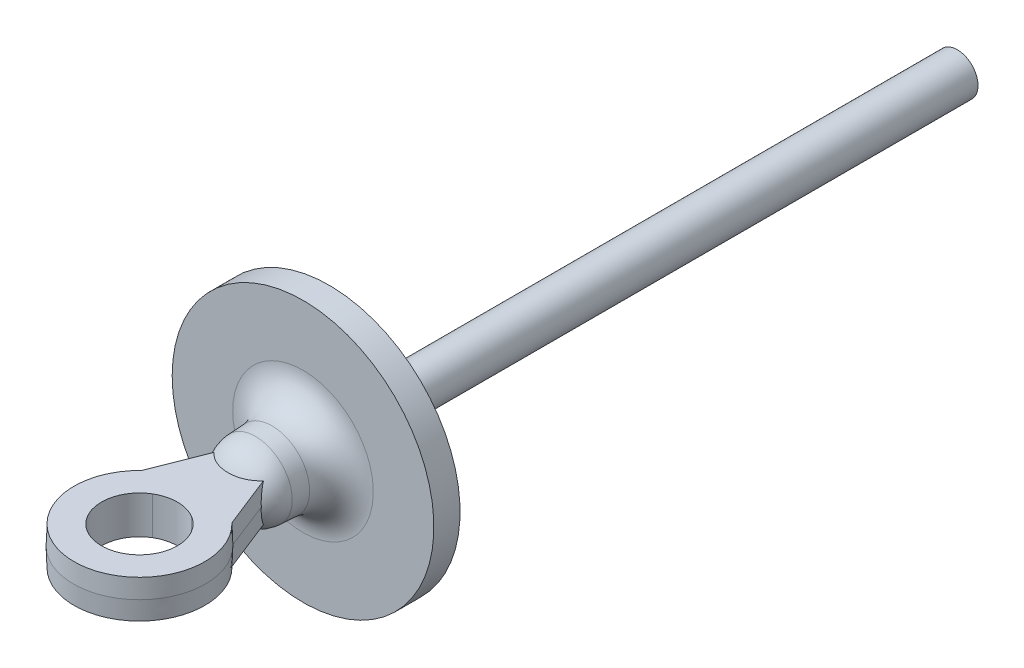
ISO-10303-21;
HEADER;
FILE_DESCRIPTION(('STEP AP214'),'2;1');
FILE_NAME('part.step','',(''),(''),'','','');
FILE_SCHEMA(('AUTOMOTIVE_DESIGN { 1 0 10303 214 1 1 1 1 }'));
ENDSEC;
DATA;
#1=APPLICATION_CONTEXT('core data for automotive mechanical design processes');
#2=APPLICATION_PROTOCOL_DEFINITION('international standard','automotive_design',2000,#1);
#3=PRODUCT_CONTEXT('',#1,'mechanical');
#4=PRODUCT('Part','Part','',(#3));
#5=PRODUCT_RELATED_PRODUCT_CATEGORY('part','',(#4));
#6=PRODUCT_DEFINITION_FORMATION('','',#4);
#7=PRODUCT_DEFINITION_CONTEXT('part definition',#1,'design');
#8=PRODUCT_DEFINITION('design','',#6,#7);
#9=PRODUCT_DEFINITION_SHAPE('','',#8);
#10=(LENGTH_UNIT() NAMED_UNIT(*) SI_UNIT(.MILLI.,.METRE.));
#11=(NAMED_UNIT(*) PLANE_ANGLE_UNIT() SI_UNIT($,.RADIAN.));
#12=(NAMED_UNIT(*) SI_UNIT($,.STERADIAN.) SOLID_ANGLE_UNIT());
#13=UNCERTAINTY_MEASURE_WITH_UNIT(LENGTH_MEASURE(1.E-05),#10,'distance_accuracy_value','');
#14=(GEOMETRIC_REPRESENTATION_CONTEXT(3) GLOBAL_UNCERTAINTY_ASSIGNED_CONTEXT((#13)) GLOBAL_UNIT_ASSIGNED_CONTEXT((#10,
#11,#12)) REPRESENTATION_CONTEXT('',''));
#15=CARTESIAN_POINT('',(0.,0.,0.));
#16=DIRECTION('',(0.,0.,1.));
#17=DIRECTION('',(1.,0.,0.));
#18=AXIS2_PLACEMENT_3D('',#15,#16,#17);
#19=CARTESIAN_POINT('',(0.,3.,12.5));
#20=DIRECTION('',(0.,-1.,0.));
#21=DIRECTION('',(0.,0.,-1.));
#22=AXIS2_PLACEMENT_3D('',#19,#20,#21);
#23=CYLINDRICAL_SURFACE('',#22,2.9);
#24=DIRECTION('',(0.,-1.,0.));
#25=VECTOR('',#24,1.);
#26=CARTESIAN_POINT('',(-1.5,3.,14.9819347291982));
#27=LINE('',#26,#25);
#28=CARTESIAN_POINT('',(-1.5,-1.45,14.9819347291982));
#29=VERTEX_POINT('',#28);
#30=CARTESIAN_POINT('',(-1.5,1.45,14.9819347291982));
#31=VERTEX_POINT('',#30);
#32=EDGE_CURVE('E66',#29,#31,#27,.F.);
#33=ORIENTED_EDGE('',*,*,#32,.F.);
#34=CARTESIAN_POINT('',(0.,-1.45,12.5));
#35=DIRECTION('',(0.,-1.,0.));
#36=DIRECTION('',(0.,0.,-1.));
#37=AXIS2_PLACEMENT_3D('',#34,#35,#36);
#38=CIRCLE('',#37,2.9);
#39=CARTESIAN_POINT('',(-1.5,-1.45,10.0180652708018));
#40=VERTEX_POINT('',#39);
#41=EDGE_CURVE('E345',#29,#40,#38,.T.);
#42=ORIENTED_EDGE('',*,*,#41,.T.);
#43=DIRECTION('',(0.,-1.,0.));
#44=VECTOR('',#43,1.);
#45=CARTESIAN_POINT('',(-1.5,3.,10.0180652708018));
#46=LINE('',#45,#44);
#47=CARTESIAN_POINT('',(-1.5,1.45,10.0180652708018));
#48=VERTEX_POINT('',#47);
#49=EDGE_CURVE('E58',#48,#40,#46,.T.);
#50=ORIENTED_EDGE('',*,*,#49,.F.);
#51=CARTESIAN_POINT('',(0.,1.45,12.5));
#52=DIRECTION('',(0.,1.,0.));
#53=DIRECTION('',(0.,0.,1.));
#54=AXIS2_PLACEMENT_3D('',#51,#52,#53);
#55=CIRCLE('',#54,2.9);
#56=EDGE_CURVE('E352',#48,#31,#55,.T.);
#57=ORIENTED_EDGE('',*,*,#56,.T.);
#58=EDGE_LOOP('',(#33,#42,#50,#57));
#59=FACE_BOUND('',#58,.T.);
#60=ADVANCED_FACE('F43',(#59),#23,.F.);
#61=CARTESIAN_POINT('',(1.5,-1.45,14.9819347291982));
#62=VERTEX_POINT('',#61);
#63=EDGE_CURVE('E349',#62,#29,#38,.T.);
#64=ORIENTED_EDGE('',*,*,#63,.T.);
#65=ORIENTED_EDGE('',*,*,#32,.T.);
#66=CARTESIAN_POINT('',(1.5,1.45,14.9819347291982));
#67=VERTEX_POINT('',#66);
#68=EDGE_CURVE('E350',#31,#67,#55,.T.);
#69=ORIENTED_EDGE('',*,*,#68,.T.);
#70=DIRECTION('',(0.,-1.,0.));
#71=VECTOR('',#70,1.);
#72=CARTESIAN_POINT('',(1.5,3.,14.9819347291982));
#73=LINE('',#72,#71);
#74=EDGE_CURVE('E289',#67,#62,#73,.T.);
#75=ORIENTED_EDGE('',*,*,#74,.T.);
#76=EDGE_LOOP('',(#64,#65,#69,#75));
#77=FACE_BOUND('',#76,.T.);
#78=ADVANCED_FACE('F313',(#77),#23,.F.);
#79=DIRECTION('',(0.,-1.,0.));
#80=VECTOR('',#79,1.);
#81=CARTESIAN_POINT('',(1.5,3.,10.0180652708018));
#82=LINE('',#81,#80);
#83=CARTESIAN_POINT('',(1.5,-1.45,10.0180652708018));
#84=VERTEX_POINT('',#83);
#85=CARTESIAN_POINT('',(1.5,1.45,10.0180652708018));
#86=VERTEX_POINT('',#85);
#87=EDGE_CURVE('E292',#84,#86,#82,.F.);
#88=ORIENTED_EDGE('',*,*,#87,.F.);
#89=EDGE_CURVE('E341',#84,#62,#38,.T.);
#90=ORIENTED_EDGE('',*,*,#89,.T.);
#91=ORIENTED_EDGE('',*,*,#74,.F.);
#92=EDGE_CURVE('E253',#67,#86,#55,.T.);
#93=ORIENTED_EDGE('',*,*,#92,.T.);
#94=EDGE_LOOP('',(#88,#90,#91,#93));
#95=FACE_BOUND('',#94,.T.);
#96=ADVANCED_FACE('F319',(#95),#23,.F.);
#97=CARTESIAN_POINT('',(0.,0.,0.));
#98=DIRECTION('',(0.,0.,-1.));
#99=DIRECTION('',(1.,0.,0.));
#100=AXIS2_PLACEMENT_3D('',#97,#98,#99);
#101=CONICAL_SURFACE('',#100,3.,0.0523598775598299);
#102=CARTESIAN_POINT('',(0.,0.,2.36916010939264));
#103=DIRECTION('',(0.,0.,-1.));
#104=DIRECTION('',(-1.,0.,0.));
#105=AXIS2_PLACEMENT_3D('',#102,#103,#104);
#106=CIRCLE('',#105,2.87583757990077);
#107=CARTESIAN_POINT('',(-2.87583757990077,0.,2.36916010939264));
#108=VERTEX_POINT('',#107);
#109=EDGE_CURVE('E284',#108,#108,#106,.F.);
#110=ORIENTED_EDGE('',*,*,#109,.T.);
#111=EDGE_LOOP('',(#110));
#112=FACE_BOUND('',#111,.T.);
#113=CARTESIAN_POINT('',(0.,0.,3.63083989060736));
#114=DIRECTION('',(0.,0.,-1.));
#115=DIRECTION('',(-1.,0.,0.));
#116=AXIS2_PLACEMENT_3D('',#113,#114,#115);
#117=CIRCLE('',#116,2.80971574440099);
#118=CARTESIAN_POINT('',(-2.80971574440099,0.,3.63083989060736));
#119=VERTEX_POINT('',#118);
#120=EDGE_CURVE('E155',#119,#119,#117,.T.);
#121=ORIENTED_EDGE('',*,*,#120,.T.);
#122=EDGE_LOOP('',(#121));
#123=FACE_BOUND('',#122,.T.);
#124=ADVANCED_FACE('F212',(#112,#123),#101,.T.);
#125=CARTESIAN_POINT('',(0.,0.,3.5));
#126=DIRECTION('',(0.,0.,1.));
#127=DIRECTION('',(1.,0.,0.));
#128=AXIS2_PLACEMENT_3D('',#125,#126,#127);
#129=DEGENERATE_TOROIDAL_SURFACE('',#128,0.313141907514554,2.5,.T.);
#130=CARTESIAN_POINT('',(0.,1.45,5.72655646179259));
#131=CARTESIAN_POINT('',(-0.129432593562339,1.45,5.72655944428097));
#132=CARTESIAN_POINT('',(-0.25891069393167,1.45,5.71774550370357));
#133=CARTESIAN_POINT('',(-0.515472929276135,1.45,5.68200671977936));
#134=CARTESIAN_POINT('',(-0.642554763818849,1.45,5.6550653016633));
#135=CARTESIAN_POINT('',(-0.914960953573059,1.45,5.575254194133));
#136=CARTESIAN_POINT('',(-1.05916477908325,1.45,5.51843126446166));
#137=CARTESIAN_POINT('',(-1.33380919502062,1.45,5.37783438260432));
#138=CARTESIAN_POINT('',(-1.46425847907008,1.45,5.29407759133726));
#139=CARTESIAN_POINT('',(-1.69008827611561,1.45,5.11404249081609));
#140=CARTESIAN_POINT('',(-1.7878183681388,1.45,5.02070292204882));
#141=CARTESIAN_POINT('',(-1.96465283927292,1.45,4.81778176007111));
#142=CARTESIAN_POINT('',(-2.04376458793473,1.45,4.70820662133922));
#143=CARTESIAN_POINT('',(-2.17525604669129,1.45,4.48504570467868));
#144=CARTESIAN_POINT('',(-2.22919399080737,1.45,4.37237479701423));
#145=CARTESIAN_POINT('',(-2.31683466177211,1.45,4.13942935715929));
#146=CARTESIAN_POINT('',(-2.35054253415065,1.45,4.01915676707076));
#147=CARTESIAN_POINT('',(-2.39604842669348,1.45,3.77765905330952));
#148=CARTESIAN_POINT('',(-2.40837269438678,1.45,3.65653276482782));
#149=CARTESIAN_POINT('',(-2.41236179725301,1.45,3.41394011254067));
#150=CARTESIAN_POINT('',(-2.40402742650024,1.45,3.29247376198574));
#151=CARTESIAN_POINT('',(-2.36708519784108,1.45,3.05350372859745));
#152=CARTESIAN_POINT('',(-2.33861341180446,1.45,2.93597896394068));
#153=CARTESIAN_POINT('',(-2.26242637086176,1.45,2.70735096778084));
#154=CARTESIAN_POINT('',(-2.21471157309239,1.45,2.59624758380324));
#155=CARTESIAN_POINT('',(-2.10125159303751,1.45,2.38303819516633));
#156=CARTESIAN_POINT('',(-2.03542724922457,1.45,2.28097435591363));
#157=CARTESIAN_POINT('',(-1.88786524087532,1.45,2.0890994421096));
#158=CARTESIAN_POINT('',(-1.80612657564311,1.45,1.99928913866749));
#159=CARTESIAN_POINT('',(-1.62754147830039,1.45,1.83254118270238));
#160=CARTESIAN_POINT('',(-1.53044019371077,1.45,1.75587689544591));
#161=CARTESIAN_POINT('',(-1.32526220301271,1.45,1.61911226008083));
#162=CARTESIAN_POINT('',(-1.21718622971569,1.45,1.55901080701827));
#163=CARTESIAN_POINT('',(-0.987697317999504,1.45,1.45358349369978));
#164=CARTESIAN_POINT('',(-0.865891632246593,1.45,1.40911653650356));
#165=CARTESIAN_POINT('',(-0.616955438332788,1.45,1.33897833934028));
#166=CARTESIAN_POINT('',(-0.489820291704596,1.45,1.3133238474775));
#167=CARTESIAN_POINT('',(-0.218708461265621,1.45,1.27813559717604));
#168=CARTESIAN_POINT('',(-0.0744555168632201,1.45,1.27075739550981));
#169=CARTESIAN_POINT('',(0.213672924824405,1.45,1.27783648934484));
#170=CARTESIAN_POINT('',(0.357548141404934,1.45,1.29230698017118));
#171=CARTESIAN_POINT('',(0.577061114087893,1.45,1.33228599961138));
#172=CARTESIAN_POINT('',(0.654200760048113,1.45,1.3498696003863));
#173=CARTESIAN_POINT('',(0.806526236429909,1.45,1.392047485229));
#174=CARTESIAN_POINT('',(0.881712948978836,1.45,1.4166385418002));
#175=CARTESIAN_POINT('',(1.02933956399933,1.45,1.47290101197061));
#176=CARTESIAN_POINT('',(1.1017814178851,1.45,1.50456728074244));
#177=CARTESIAN_POINT('',(1.24314257796768,1.45,1.57491403419551));
#178=CARTESIAN_POINT('',(1.3120624319109,1.45,1.61359342390466));
#179=CARTESIAN_POINT('',(1.49725981156641,1.45,1.73040965937281));
#180=CARTESIAN_POINT('',(1.60900226991726,1.45,1.81594847893451));
#181=CARTESIAN_POINT('',(1.81446692252279,1.45,2.00639898759868));
#182=CARTESIAN_POINT('',(1.90819434208063,1.45,2.11130504183003));
#183=CARTESIAN_POINT('',(2.06577984593887,1.45,2.32595925209762));
#184=CARTESIAN_POINT('',(2.13166663033934,1.45,2.43422168303378));
#185=CARTESIAN_POINT('',(2.24356822545718,1.45,2.66054944264468));
#186=CARTESIAN_POINT('',(2.28959045344593,1.45,2.77861109269995));
#187=CARTESIAN_POINT('',(2.35901933504922,1.45,3.0167947822558));
#188=CARTESIAN_POINT('',(2.38314834727159,1.45,3.13670683981947));
#189=CARTESIAN_POINT('',(2.41069777738649,1.45,3.37888803262521));
#190=CARTESIAN_POINT('',(2.41411942777485,1.45,3.50115702714853));
#191=CARTESIAN_POINT('',(2.40022084573934,1.45,3.7432093570347));
#192=CARTESIAN_POINT('',(2.38311892105719,1.45,3.86300530788176));
#193=CARTESIAN_POINT('',(2.32906868447815,1.45,4.09802735392697));
#194=CARTESIAN_POINT('',(2.29212083221616,1.45,4.21325355489489));
#195=CARTESIAN_POINT('',(2.19945561520322,1.45,4.4360700537067));
#196=CARTESIAN_POINT('',(2.14371279319005,1.45,4.54364975399851));
#197=CARTESIAN_POINT('',(2.01518795537887,1.45,4.74807954381759));
#198=CARTESIAN_POINT('',(1.94240594873373,1.45,4.84492963910838));
#199=CARTESIAN_POINT('',(1.78090759706314,1.45,5.02667593577594));
#200=CARTESIAN_POINT('',(1.69198580940245,1.45,5.11138934935079));
#201=CARTESIAN_POINT('',(1.50161893313016,1.45,5.2652981610603));
#202=CARTESIAN_POINT('',(1.40017209502277,1.45,5.33449138752861));
#203=CARTESIAN_POINT('',(1.18374649751807,1.45,5.45843831258769));
#204=CARTESIAN_POINT('',(1.06840247660055,1.45,5.51255165226957));
#205=CARTESIAN_POINT('',(0.830838884987243,1.45,5.60239258068455));
#206=CARTESIAN_POINT('',(0.708620391589674,1.45,5.63812304134198));
#207=CARTESIAN_POINT('',(0.48858165889762,1.45,5.68564446463316));
#208=CARTESIAN_POINT('',(0.391509554092255,1.45,5.70102573476573));
#209=CARTESIAN_POINT('',(0.196300349225021,1.45,5.72148053972361));
#210=CARTESIAN_POINT('',(0.0981632621224855,1.45,5.72655419983693));
#211=CARTESIAN_POINT('',(0.,1.45,5.72655646179259));
#212=B_SPLINE_CURVE_WITH_KNOTS('',3,(#130,#131,#132,#133,#134,#135,#136,#137,#138,#139,#140,
#141,#142,#143,#144,#145,#146,#147,#148,#149,#150,#151,#152,#153,#154,#155,#156,#157,#158,#159,
#160,#161,#162,#163,#164,#165,#166,#167,#168,#169,#170,#171,#172,#173,#174,#175,#176,#177,#178,
#179,#180,#181,#182,#183,#184,#185,#186,#187,#188,#189,#190,#191,#192,#193,#194,#195,#196,#197,
#198,#199,#200,#201,#202,#203,#204,#205,#206,#207,#208,#209,#210,#211),.UNSPECIFIED.,.T.,.F.,(4,
2,2,2,2,2,2,2,2,2,2,2,2,2,2,2,2,2,2,2,2,2,2,2,2,2,2,2,2,2,2,2,2,2,2,2,2,2,2,2,4),(0.,
0.38805083592315,0.776456967237292,1.23864674616536,1.70054262226772,2.10381060569464,
2.50691869727785,2.87983881335085,3.25266403674374,3.61617658104903,3.97967515291897,
4.34074068491568,4.70179763994994,5.06445865683153,5.42714248528368,5.79663621738755,
6.16610529353943,6.55350999143322,6.94125916534668,7.37293596803576,7.8048735824228,
8.04194529196958,8.27890798693873,8.5156989291473,8.75245293251589,9.17206141552596,
9.59154800586081,9.96986415673185,10.3480389248264,10.7132269607965,11.0783932606727,
11.4397094991071,11.8010173697597,12.1628166010016,12.5246156378977,12.8913921598034,
13.2582199710413,13.6388332251108,14.0193869985821,14.3136930763034,14.6079955767415),.UNSPECIFIED.);
#213=CARTESIAN_POINT('',(1.88397693499919,1.45,4.9103116327655));
#214=VERTEX_POINT('',#213);
#215=CARTESIAN_POINT('',(-1.88397693500169,1.45,4.91031163277184));
#216=VERTEX_POINT('',#215);
#217=EDGE_CURVE('E198',#214,#216,#212,.T.);
#218=ORIENTED_EDGE('',*,*,#217,.F.);
#219=CARTESIAN_POINT('',(1.88392343403672,1.4502,4.91019512697445));
#220=CARTESIAN_POINT('',(1.89857066782441,1.39545097410603,4.94209208780257));
#221=CARTESIAN_POINT('',(1.91246457356835,1.33934930373896,4.97195210861302));
#222=CARTESIAN_POINT('',(1.93869681601967,1.22478940428401,5.02750753128141));
#223=CARTESIAN_POINT('',(1.95103558062409,1.16633182929131,5.05320407927686));
#224=CARTESIAN_POINT('',(1.9851602314905,0.990463485823493,5.12292159861242));
#225=CARTESIAN_POINT('',(2.00468763179078,0.870168848498023,5.16094720220688));
#226=CARTESIAN_POINT('',(2.03702175188753,0.627175606075397,5.21974523590089));
#227=CARTESIAN_POINT('',(2.0499521758606,0.504569711140613,5.24083984530746));
#228=CARTESIAN_POINT('',(2.06975745738624,0.254561968634857,5.26723324476132));
#229=CARTESIAN_POINT('',(2.07649965569111,0.127113464133685,5.27219155069367));
#230=CARTESIAN_POINT('',(2.07992207646305,-0.000199999999999989,5.26875317685439));
#231=B_SPLINE_CURVE_WITH_KNOTS('',3,(#219,#220,#221,#222,#223,#224,#225,#226,#227,#228,#229,
#230),.UNSPECIFIED.,.F.,.F.,(4,2,2,2,2,4),(0.,0.194995372853274,0.389936975058389,
0.771423053302842,1.14546527465368,1.52735048015725),.UNSPECIFIED.);
#232=CARTESIAN_POINT('',(2.07991669401542,0.,5.26875856288613));
#233=VERTEX_POINT('',#232);
#234=EDGE_CURVE('E190',#214,#233,#231,.T.);
#235=ORIENTED_EDGE('',*,*,#234,.T.);
#236=CARTESIAN_POINT('',(1.88392343403672,-1.4502,4.91019512697445));
#237=CARTESIAN_POINT('',(1.89857066782441,-1.39545097410603,4.94209208780257));
#238=CARTESIAN_POINT('',(1.91246457356835,-1.33934930373896,4.97195210861302));
#239=CARTESIAN_POINT('',(1.93869681601967,-1.22478940428401,5.02750753128141));
#240=CARTESIAN_POINT('',(1.95103558062409,-1.16633182929131,5.05320407927686));
#241=CARTESIAN_POINT('',(1.9851602314905,-0.990463485823493,5.12292159861242));
#242=CARTESIAN_POINT('',(2.00468763179078,-0.870168848498023,5.16094720220688));
#243=CARTESIAN_POINT('',(2.03702175188753,-0.627175606075397,5.21974523590089));
#244=CARTESIAN_POINT('',(2.0499521758606,-0.504569711140613,5.24083984530746));
#245=CARTESIAN_POINT('',(2.06975745738624,-0.254561968634857,5.26723324476132));
#246=CARTESIAN_POINT('',(2.07649965569111,-0.127113464133685,5.27219155069367));
#247=CARTESIAN_POINT('',(2.07992207646305,0.000199999999999989,5.26875317685439));
#248=B_SPLINE_CURVE_WITH_KNOTS('',3,(#236,#237,#238,#239,#240,#241,#242,#243,#244,#245,#246,
#247),.UNSPECIFIED.,.F.,.F.,(4,2,2,2,2,4),(0.,0.194995372853274,0.389936975058389,
0.771423053302842,1.14546527465368,1.52735048015725),.UNSPECIFIED.);
#249=CARTESIAN_POINT('',(1.88397693499919,-1.45,4.9103116327655));
#250=VERTEX_POINT('',#249);
#251=EDGE_CURVE('E142',#250,#233,#248,.T.);
#252=ORIENTED_EDGE('',*,*,#251,.F.);
#253=CARTESIAN_POINT('',(0.,-1.45,5.72655646179259));
#254=CARTESIAN_POINT('',(-0.129432593562339,-1.45,5.72655944428097));
#255=CARTESIAN_POINT('',(-0.25891069393167,-1.45,5.71774550370357));
#256=CARTESIAN_POINT('',(-0.515472929276135,-1.45,5.68200671977936));
#257=CARTESIAN_POINT('',(-0.642554763818849,-1.45,5.6550653016633));
#258=CARTESIAN_POINT('',(-0.914960953573059,-1.45,5.575254194133));
#259=CARTESIAN_POINT('',(-1.05916477908325,-1.45,5.51843126446166));
#260=CARTESIAN_POINT('',(-1.33380919502062,-1.45,5.37783438260432));
#261=CARTESIAN_POINT('',(-1.46425847907008,-1.45,5.29407759133726));
#262=CARTESIAN_POINT('',(-1.69008827611561,-1.45,5.11404249081609));
#263=CARTESIAN_POINT('',(-1.7878183681388,-1.45,5.02070292204882));
#264=CARTESIAN_POINT('',(-1.96465283927292,-1.45,4.81778176007111));
#265=CARTESIAN_POINT('',(-2.04376458793473,-1.45,4.70820662133922));
#266=CARTESIAN_POINT('',(-2.17525604669129,-1.45,4.48504570467868));
#267=CARTESIAN_POINT('',(-2.22919399080737,-1.45,4.37237479701423));
#268=CARTESIAN_POINT('',(-2.31683466177211,-1.45,4.13942935715929));
#269=CARTESIAN_POINT('',(-2.35054253415065,-1.45,4.01915676707076));
#270=CARTESIAN_POINT('',(-2.39604842669348,-1.45,3.77765905330952));
#271=CARTESIAN_POINT('',(-2.40837269438678,-1.45,3.65653276482782));
#272=CARTESIAN_POINT('',(-2.41236179725301,-1.45,3.41394011254067));
#273=CARTESIAN_POINT('',(-2.40402742650024,-1.45,3.29247376198574));
#274=CARTESIAN_POINT('',(-2.36708519784108,-1.45,3.05350372859745));
#275=CARTESIAN_POINT('',(-2.33861341180446,-1.45,2.93597896394068));
#276=CARTESIAN_POINT('',(-2.26242637086176,-1.45,2.70735096778084));
#277=CARTESIAN_POINT('',(-2.21471157309239,-1.45,2.59624758380324));
#278=CARTESIAN_POINT('',(-2.10125159303751,-1.45,2.38303819516633));
#279=CARTESIAN_POINT('',(-2.03542724922457,-1.45,2.28097435591363));
#280=CARTESIAN_POINT('',(-1.88786524087532,-1.45,2.0890994421096));
#281=CARTESIAN_POINT('',(-1.80612657564311,-1.45,1.99928913866749));
#282=CARTESIAN_POINT('',(-1.62754147830039,-1.45,1.83254118270238));
#283=CARTESIAN_POINT('',(-1.53044019371077,-1.45,1.75587689544591));
#284=CARTESIAN_POINT('',(-1.32526220301271,-1.45,1.61911226008083));
#285=CARTESIAN_POINT('',(-1.21718622971569,-1.45,1.55901080701827));
#286=CARTESIAN_POINT('',(-0.987697317999504,-1.45,1.45358349369978));
#287=CARTESIAN_POINT('',(-0.865891632246593,-1.45,1.40911653650356));
#288=CARTESIAN_POINT('',(-0.616955438332788,-1.45,1.33897833934028));
#289=CARTESIAN_POINT('',(-0.489820291704596,-1.45,1.3133238474775));
#290=CARTESIAN_POINT('',(-0.218708461265621,-1.45,1.27813559717604));
#291=CARTESIAN_POINT('',(-0.0744555168632201,-1.45,1.27075739550981));
#292=CARTESIAN_POINT('',(0.213672924824405,-1.45,1.27783648934484));
#293=CARTESIAN_POINT('',(0.357548141404934,-1.45,1.29230698017118));
#294=CARTESIAN_POINT('',(0.577061114087893,-1.45,1.33228599961138));
#295=CARTESIAN_POINT('',(0.654200760048113,-1.45,1.3498696003863));
#296=CARTESIAN_POINT('',(0.806526236429909,-1.45,1.392047485229));
#297=CARTESIAN_POINT('',(0.881712948978836,-1.45,1.4166385418002));
#298=CARTESIAN_POINT('',(1.02933956399933,-1.45,1.47290101197061));
#299=CARTESIAN_POINT('',(1.1017814178851,-1.45,1.50456728074244));
#300=CARTESIAN_POINT('',(1.24314257796768,-1.45,1.57491403419551));
#301=CARTESIAN_POINT('',(1.3120624319109,-1.45,1.61359342390466));
#302=CARTESIAN_POINT('',(1.49725981156641,-1.45,1.73040965937281));
#303=CARTESIAN_POINT('',(1.60900226991726,-1.45,1.81594847893451));
#304=CARTESIAN_POINT('',(1.81446692252279,-1.45,2.00639898759868));
#305=CARTESIAN_POINT('',(1.90819434208063,-1.45,2.11130504183003));
#306=CARTESIAN_POINT('',(2.06577984593887,-1.45,2.32595925209762));
#307=CARTESIAN_POINT('',(2.13166663033934,-1.45,2.43422168303378));
#308=CARTESIAN_POINT('',(2.24356822545718,-1.45,2.66054944264468));
#309=CARTESIAN_POINT('',(2.28959045344593,-1.45,2.77861109269995));
#310=CARTESIAN_POINT('',(2.35901933504922,-1.45,3.0167947822558));
#311=CARTESIAN_POINT('',(2.38314834727159,-1.45,3.13670683981947));
#312=CARTESIAN_POINT('',(2.41069777738649,-1.45,3.37888803262521));
#313=CARTESIAN_POINT('',(2.41411942777485,-1.45,3.50115702714853));
#314=CARTESIAN_POINT('',(2.40022084573934,-1.45,3.7432093570347));
#315=CARTESIAN_POINT('',(2.38311892105719,-1.45,3.86300530788176));
#316=CARTESIAN_POINT('',(2.32906868447815,-1.45,4.09802735392697));
#317=CARTESIAN_POINT('',(2.29212083221616,-1.45,4.21325355489489));
#318=CARTESIAN_POINT('',(2.19945561520322,-1.45,4.4360700537067));
#319=CARTESIAN_POINT('',(2.14371279319005,-1.45,4.54364975399851));
#320=CARTESIAN_POINT('',(2.01518795537887,-1.45,4.74807954381759));
#321=CARTESIAN_POINT('',(1.94240594873373,-1.45,4.84492963910838));
#322=CARTESIAN_POINT('',(1.78090759706314,-1.45,5.02667593577594));
#323=CARTESIAN_POINT('',(1.69198580940245,-1.45,5.11138934935079));
#324=CARTESIAN_POINT('',(1.50161893313016,-1.45,5.2652981610603));
#325=CARTESIAN_POINT('',(1.40017209502277,-1.45,5.33449138752861));
#326=CARTESIAN_POINT('',(1.18374649751807,-1.45,5.45843831258769));
#327=CARTESIAN_POINT('',(1.06840247660055,-1.45,5.51255165226957));
#328=CARTESIAN_POINT('',(0.830838884987243,-1.45,5.60239258068455));
#329=CARTESIAN_POINT('',(0.708620391589674,-1.45,5.63812304134198));
#330=CARTESIAN_POINT('',(0.48858165889762,-1.45,5.68564446463316));
#331=CARTESIAN_POINT('',(0.391509554092255,-1.45,5.70102573476573));
#332=CARTESIAN_POINT('',(0.196300349225021,-1.45,5.72148053972361));
#333=CARTESIAN_POINT('',(0.0981632621224855,-1.45,5.72655419983693));
#334=CARTESIAN_POINT('',(0.,-1.45,5.72655646179259));
#335=B_SPLINE_CURVE_WITH_KNOTS('',3,(#253,#254,#255,#256,#257,#258,#259,#260,#261,#262,#263,
#264,#265,#266,#267,#268,#269,#270,#271,#272,#273,#274,#275,#276,#277,#278,#279,#280,#281,#282,
#283,#284,#285,#286,#287,#288,#289,#290,#291,#292,#293,#294,#295,#296,#297,#298,#299,#300,#301,
#302,#303,#304,#305,#306,#307,#308,#309,#310,#311,#312,#313,#314,#315,#316,#317,#318,#319,#320,
#321,#322,#323,#324,#325,#326,#327,#328,#329,#330,#331,#332,#333,#334),.UNSPECIFIED.,.T.,.F.,(4,
2,2,2,2,2,2,2,2,2,2,2,2,2,2,2,2,2,2,2,2,2,2,2,2,2,2,2,2,2,2,2,2,2,2,2,2,2,2,2,4),(0.,
0.38805083592315,0.776456967237292,1.23864674616536,1.70054262226772,2.10381060569464,
2.50691869727785,2.87983881335085,3.25266403674374,3.61617658104903,3.97967515291897,
4.34074068491568,4.70179763994994,5.06445865683153,5.42714248528368,5.79663621738755,
6.16610529353943,6.55350999143322,6.94125916534668,7.37293596803576,7.8048735824228,
8.04194529196958,8.27890798693873,8.5156989291473,8.75245293251589,9.17206141552596,
9.59154800586081,9.96986415673185,10.3480389248264,10.7132269607965,11.0783932606727,
11.4397094991071,11.8010173697597,12.1628166010016,12.5246156378977,12.8913921598034,
13.2582199710413,13.6388332251108,14.0193869985821,14.3136930763034,14.6079955767415),.UNSPECIFIED.);
#336=CARTESIAN_POINT('',(-1.88397693498961,-1.45,4.91031163277661));
#337=VERTEX_POINT('',#336);
#338=EDGE_CURVE('E218',#250,#337,#335,.T.);
#339=ORIENTED_EDGE('',*,*,#338,.T.);
#340=CARTESIAN_POINT('',(-2.07992207646306,0.0002,5.26875317685439));
#341=CARTESIAN_POINT('',(-2.077861978553,-0.0762654497678526,5.27080672543901));
#342=CARTESIAN_POINT('',(-2.07461288343559,-0.152736470783567,5.26984888553578));
#343=CARTESIAN_POINT('',(-2.06574404873067,-0.305256728177471,5.26188787460582));
#344=CARTESIAN_POINT('',(-2.0601233117411,-0.381305773443541,5.25488215882625));
#345=CARTESIAN_POINT('',(-2.04006880518193,-0.604183102086815,5.2252772458012));
#346=CARTESIAN_POINT('',(-2.02233265249249,-0.749725032824353,5.19419025267558));
#347=CARTESIAN_POINT('',(-1.98508056437687,-0.988393699253641,5.12252294602434));
#348=CARTESIAN_POINT('',(-1.96783821949664,-1.08373084491195,5.08791221450706));
#349=CARTESIAN_POINT('',(-1.92907194162086,-1.27066826604292,5.00748942230706));
#350=CARTESIAN_POINT('',(-1.90747887085611,-1.36217492679031,4.96149332164692));
#351=CARTESIAN_POINT('',(-1.88392343403672,-1.4502,4.91019512697445));
#352=B_SPLINE_CURVE_WITH_KNOTS('',3,(#340,#341,#342,#343,#344,#345,#346,#347,#348,#349,#350,
#351),.UNSPECIFIED.,.F.,.F.,(4,2,2,2,2,4),(0.,0.22940567122817,0.458907916103139,
0.906101676179573,1.21405700611173,1.52735891870478),.UNSPECIFIED.);
#353=CARTESIAN_POINT('',(-2.07991669401557,0.,5.2687585628865));
#354=VERTEX_POINT('',#353);
#355=EDGE_CURVE('E233',#354,#337,#352,.T.);
#356=ORIENTED_EDGE('',*,*,#355,.F.);
#357=CARTESIAN_POINT('',(-2.07992207646306,-0.0002,5.26875317685439));
#358=CARTESIAN_POINT('',(-2.077861978553,0.0762654497678526,5.27080672543901));
#359=CARTESIAN_POINT('',(-2.07461288343559,0.152736470783567,5.26984888553578));
#360=CARTESIAN_POINT('',(-2.06574404873067,0.305256728177471,5.26188787460582));
#361=CARTESIAN_POINT('',(-2.0601233117411,0.381305773443541,5.25488215882625));
#362=CARTESIAN_POINT('',(-2.04006880518193,0.604183102086815,5.2252772458012));
#363=CARTESIAN_POINT('',(-2.02233265249249,0.749725032824353,5.19419025267558));
#364=CARTESIAN_POINT('',(-1.98508056437687,0.988393699253641,5.12252294602434));
#365=CARTESIAN_POINT('',(-1.96783821949664,1.08373084491195,5.08791221450706));
#366=CARTESIAN_POINT('',(-1.92907194162086,1.27066826604292,5.00748942230706));
#367=CARTESIAN_POINT('',(-1.90747887085611,1.36217492679031,4.96149332164692));
#368=CARTESIAN_POINT('',(-1.88392343403672,1.4502,4.91019512697445));
#369=B_SPLINE_CURVE_WITH_KNOTS('',3,(#357,#358,#359,#360,#361,#362,#363,#364,#365,#366,#367,
#368),.UNSPECIFIED.,.F.,.F.,(4,2,2,2,2,4),(0.,0.22940567122817,0.458907916103139,
0.906101676179573,1.21405700611173,1.52735891870478),.UNSPECIFIED.);
#370=EDGE_CURVE('E199',#354,#216,#369,.T.);
#371=ORIENTED_EDGE('',*,*,#370,.T.);
#372=EDGE_LOOP('',(#218,#235,#252,#339,#356,#371));
#373=FACE_BOUND('',#372,.T.);
#374=ORIENTED_EDGE('',*,*,#120,.F.);
#375=EDGE_LOOP('',(#374));
#376=FACE_BOUND('',#375,.T.);
#377=ADVANCED_FACE('F209',(#373,#376),#129,.T.);
#378=CARTESIAN_POINT('',(0.,0.,12.5));
#379=DIRECTION('',(0.,-1.,0.));
#380=DIRECTION('',(0.,0.,1.));
#381=AXIS2_PLACEMENT_3D('',#378,#379,#380);
#382=CONICAL_SURFACE('',#381,5.05,0.0349065850398867);
#383=CARTESIAN_POINT('',(0.,0.,12.5));
#384=DIRECTION('',(0.,1.,0.));
#385=DIRECTION('',(0.,0.,1.));
#386=AXIS2_PLACEMENT_3D('',#383,#384,#385);
#387=CIRCLE('',#386,5.05);
#388=CARTESIAN_POINT('',(-3.49589719348829,0.,8.8556615397907));
#389=VERTEX_POINT('',#388);
#390=CARTESIAN_POINT('',(3.49589719348829,0.,8.8556615397907));
#391=VERTEX_POINT('',#390);
#392=EDGE_CURVE('E127',#389,#391,#387,.T.);
#393=ORIENTED_EDGE('',*,*,#392,.T.);
#394=CARTESIAN_POINT('',(3.45287195748357,1.45,8.88457132680435));
#395=CARTESIAN_POINT('',(3.46004103683905,1.20833337062255,8.87974848977166));
#396=CARTESIAN_POINT('',(3.46721101285051,0.966666722600435,8.87492792233751));
#397=CARTESIAN_POINT('',(3.48155275818542,0.483333389267102,8.8652913266663));
#398=CARTESIAN_POINT('',(3.48872452750886,0.241666703955887,8.86047529842923));
#399=CARTESIAN_POINT('',(3.49589719348829,0.,8.8556615397907));
#400=B_SPLINE_CURVE_WITH_KNOTS('',3,(#394,#395,#396,#397,#398,#399),.UNSPECIFIED.,.F.,.F.,(4,2,
4),(0.,0.725463118796364,1.45092623759198),.UNSPECIFIED.);
#401=CARTESIAN_POINT('',(3.45287195748357,1.45,8.88457132680435));
#402=VERTEX_POINT('',#401);
#403=EDGE_CURVE('E148',#402,#391,#400,.T.);
#404=ORIENTED_EDGE('',*,*,#403,.F.);
#405=CARTESIAN_POINT('',(0.,1.45,12.5));
#406=DIRECTION('',(0.,1.,0.));
#407=DIRECTION('',(0.,0.,1.));
#408=AXIS2_PLACEMENT_3D('',#405,#406,#407);
#409=CIRCLE('',#408,4.99936488423697);
#410=CARTESIAN_POINT('',(-3.45287195748357,1.45,8.88457132680435));
#411=VERTEX_POINT('',#410);
#412=EDGE_CURVE('E167',#411,#402,#409,.T.);
#413=ORIENTED_EDGE('',*,*,#412,.F.);
#414=CARTESIAN_POINT('',(-3.45287195748357,1.45,8.88457132680435));
#415=CARTESIAN_POINT('',(-3.46004103683905,1.20833337062255,8.87974848977167));
#416=CARTESIAN_POINT('',(-3.46721101285052,0.966666722600435,8.87492792233752));
#417=CARTESIAN_POINT('',(-3.48155275818542,0.483333389267102,8.8652913266663));
#418=CARTESIAN_POINT('',(-3.48872452750886,0.241666703955887,8.86047529842923));
#419=CARTESIAN_POINT('',(-3.49589719348829,0.,8.8556615397907));
#420=B_SPLINE_CURVE_WITH_KNOTS('',3,(#414,#415,#416,#417,#418,#419),.UNSPECIFIED.,.F.,.F.,(4,2,
4),(0.,0.725463118796364,1.45092623759198),.UNSPECIFIED.);
#421=EDGE_CURVE('E156',#411,#389,#420,.T.);
#422=ORIENTED_EDGE('',*,*,#421,.T.);
#423=EDGE_LOOP('',(#393,#404,#413,#422));
#424=FACE_BOUND('',#423,.T.);
#425=ADVANCED_FACE('F158',(#424),#382,.T.);
#426=CARTESIAN_POINT('',(3.49589719348829,0.,8.8556615397907));
#427=DIRECTION('',(0.929579944329516,0.034899496702501,-0.366964783365169));
#428=DIRECTION('',(-0.367188464656738,0.,-0.930146564484881));
#429=AXIS2_PLACEMENT_3D('',#426,#427,#428);
#430=PLANE('',#429);
#431=ORIENTED_EDGE('',*,*,#234,.F.);
#432=DIRECTION('',(0.367188464656738,0.,0.930146564484881));
#433=VECTOR('',#432,1.);
#434=CARTESIAN_POINT('',(3.44879911451901,1.45,8.87425417020544));
#435=LINE('',#434,#433);
#436=EDGE_CURVE('E151',#402,#214,#435,.F.);
#437=ORIENTED_EDGE('',*,*,#436,.F.);
#438=ORIENTED_EDGE('',*,*,#403,.T.);
#439=DIRECTION('',(-0.367188464656738,0.,-0.930146564484881));
#440=VECTOR('',#439,1.);
#441=CARTESIAN_POINT('',(3.49589719348829,0.,8.8556615397907));
#442=LINE('',#441,#440);
#443=EDGE_CURVE('E138',#391,#233,#442,.T.);
#444=ORIENTED_EDGE('',*,*,#443,.T.);
#445=EDGE_LOOP('',(#431,#437,#438,#444));
#446=FACE_BOUND('',#445,.T.);
#447=ADVANCED_FACE('F149',(#446),#430,.T.);
#448=CARTESIAN_POINT('',(0.,0.,0.));
#449=DIRECTION('',(-0.929579944329516,0.034899496702501,-0.366964783365169));
#450=DIRECTION('',(-0.367188464656738,0.,0.930146564484881));
#451=AXIS2_PLACEMENT_3D('',#448,#449,#450);
#452=PLANE('',#451);
#453=ORIENTED_EDGE('',*,*,#370,.F.);
#454=DIRECTION('',(-0.367188464656738,0.,0.930146564484881));
#455=VECTOR('',#454,1.);
#456=CARTESIAN_POINT('',(0.,0.,0.));
#457=LINE('',#456,#455);
#458=EDGE_CURVE('E145',#354,#389,#457,.T.);
#459=ORIENTED_EDGE('',*,*,#458,.T.);
#460=ORIENTED_EDGE('',*,*,#421,.F.);
#461=DIRECTION('',(0.367188464656738,0.,-0.930146564484881));
#462=VECTOR('',#461,1.);
#463=CARTESIAN_POINT('',(0.0470980789692806,1.45,0.0185926304147448));
#464=LINE('',#463,#462);
#465=EDGE_CURVE('E269',#216,#411,#464,.F.);
#466=ORIENTED_EDGE('',*,*,#465,.F.);
#467=EDGE_LOOP('',(#453,#459,#460,#466));
#468=FACE_BOUND('',#467,.T.);
#469=ADVANCED_FACE('F185',(#468),#452,.T.);
#470=CARTESIAN_POINT('',(0.,1.45,12.5));
#471=DIRECTION('',(0.,1.,0.));
#472=DIRECTION('',(0.,0.,1.));
#473=AXIS2_PLACEMENT_3D('',#470,#471,#472);
#474=PLANE('',#473);
#475=ORIENTED_EDGE('',*,*,#92,.F.);
#476=ORIENTED_EDGE('',*,*,#68,.F.);
#477=ORIENTED_EDGE('',*,*,#56,.F.);
#478=EDGE_CURVE('E600',#86,#48,#55,.T.);
#479=ORIENTED_EDGE('',*,*,#478,.F.);
#480=EDGE_LOOP('',(#475,#476,#477,#479));
#481=FACE_BOUND('',#480,.T.);
#482=ORIENTED_EDGE('',*,*,#436,.T.);
#483=ORIENTED_EDGE('',*,*,#217,.T.);
#484=ORIENTED_EDGE('',*,*,#465,.T.);
#485=ORIENTED_EDGE('',*,*,#412,.T.);
#486=EDGE_LOOP('',(#482,#483,#484,#485));
#487=FACE_BOUND('',#486,.T.);
#488=ADVANCED_FACE('F272',(#481,#487),#474,.T.);
#489=CARTESIAN_POINT('',(0.,0.,12.5));
#490=DIRECTION('',(0.,1.,0.));
#491=DIRECTION('',(0.,0.,1.));
#492=AXIS2_PLACEMENT_3D('',#489,#490,#491);
#493=CONICAL_SURFACE('',#492,5.05,0.0349065850398867);
#494=ORIENTED_EDGE('',*,*,#392,.F.);
#495=CARTESIAN_POINT('',(-3.45287195748357,-1.45,8.88457132680435));
#496=CARTESIAN_POINT('',(-3.46004103683905,-1.20833337062255,8.87974848977167));
#497=CARTESIAN_POINT('',(-3.46721101285052,-0.966666722600435,8.87492792233752));
#498=CARTESIAN_POINT('',(-3.48155275818542,-0.483333389267102,8.8652913266663));
#499=CARTESIAN_POINT('',(-3.48872452750886,-0.241666703955887,8.86047529842923));
#500=CARTESIAN_POINT('',(-3.49589719348829,0.,8.8556615397907));
#501=B_SPLINE_CURVE_WITH_KNOTS('',3,(#495,#496,#497,#498,#499,#500),.UNSPECIFIED.,.F.,.F.,(4,2,
4),(0.,0.725463118796364,1.45092623759198),.UNSPECIFIED.);
#502=CARTESIAN_POINT('',(-3.45287195748357,-1.45,8.88457132680435));
#503=VERTEX_POINT('',#502);
#504=EDGE_CURVE('E134',#503,#389,#501,.T.);
#505=ORIENTED_EDGE('',*,*,#504,.F.);
#506=CARTESIAN_POINT('',(0.,-1.45,12.5));
#507=DIRECTION('',(0.,1.,0.));
#508=DIRECTION('',(0.,0.,1.));
#509=AXIS2_PLACEMENT_3D('',#506,#507,#508);
#510=CIRCLE('',#509,4.99936488423697);
#511=CARTESIAN_POINT('',(3.45287195748357,-1.45,8.88457132680435));
#512=VERTEX_POINT('',#511);
#513=EDGE_CURVE('E130',#503,#512,#510,.T.);
#514=ORIENTED_EDGE('',*,*,#513,.T.);
#515=CARTESIAN_POINT('',(3.45287195748357,-1.45,8.88457132680435));
#516=CARTESIAN_POINT('',(3.46004103683905,-1.20833337062255,8.87974848977166));
#517=CARTESIAN_POINT('',(3.46721101285051,-0.966666722600435,8.87492792233751));
#518=CARTESIAN_POINT('',(3.48155275818542,-0.483333389267102,8.8652913266663));
#519=CARTESIAN_POINT('',(3.48872452750886,-0.241666703955887,8.86047529842923));
#520=CARTESIAN_POINT('',(3.49589719348829,0.,8.8556615397907));
#521=B_SPLINE_CURVE_WITH_KNOTS('',3,(#515,#516,#517,#518,#519,#520),.UNSPECIFIED.,.F.,.F.,(4,2,
4),(0.,0.725463118796364,1.45092623759198),.UNSPECIFIED.);
#522=EDGE_CURVE('E122',#512,#391,#521,.T.);
#523=ORIENTED_EDGE('',*,*,#522,.T.);
#524=EDGE_LOOP('',(#494,#505,#514,#523));
#525=FACE_BOUND('',#524,.T.);
#526=ADVANCED_FACE('F124',(#525),#493,.T.);
#527=CARTESIAN_POINT('',(0.,0.,0.));
#528=DIRECTION('',(-0.929579944329516,-0.034899496702501,-0.366964783365169));
#529=DIRECTION('',(-0.367188464656738,0.,0.930146564484881));
#530=AXIS2_PLACEMENT_3D('',#527,#528,#529);
#531=PLANE('',#530);
#532=ORIENTED_EDGE('',*,*,#458,.F.);
#533=ORIENTED_EDGE('',*,*,#355,.T.);
#534=DIRECTION('',(-0.367188464656738,0.,0.930146564484881));
#535=VECTOR('',#534,1.);
#536=CARTESIAN_POINT('',(-4.22214053251751,-1.45,10.8332505232026));
#537=LINE('',#536,#535);
#538=EDGE_CURVE('E135',#337,#503,#537,.T.);
#539=ORIENTED_EDGE('',*,*,#538,.T.);
#540=ORIENTED_EDGE('',*,*,#504,.T.);
#541=EDGE_LOOP('',(#532,#533,#539,#540));
#542=FACE_BOUND('',#541,.T.);
#543=ADVANCED_FACE('F240',(#542),#531,.T.);
#544=CARTESIAN_POINT('',(3.49589719348829,0.,8.8556615397907));
#545=DIRECTION('',(0.929579944329516,-0.034899496702501,-0.366964783365169));
#546=DIRECTION('',(-0.367188464656738,0.,-0.930146564484881));
#547=AXIS2_PLACEMENT_3D('',#544,#545,#546);
#548=PLANE('',#547);
#549=DIRECTION('',(-0.367188464656738,0.,-0.930146564484881));
#550=VECTOR('',#549,1.);
#551=CARTESIAN_POINT('',(4.22214053251751,-1.45,10.8332505232026));
#552=LINE('',#551,#550);
#553=EDGE_CURVE('E164',#512,#250,#552,.T.);
#554=ORIENTED_EDGE('',*,*,#553,.T.);
#555=ORIENTED_EDGE('',*,*,#251,.T.);
#556=ORIENTED_EDGE('',*,*,#443,.F.);
#557=ORIENTED_EDGE('',*,*,#522,.F.);
#558=EDGE_LOOP('',(#554,#555,#556,#557));
#559=FACE_BOUND('',#558,.T.);
#560=ADVANCED_FACE('F140',(#559),#548,.T.);
#561=CARTESIAN_POINT('',(0.,-1.45,12.5));
#562=DIRECTION('',(0.,1.,0.));
#563=DIRECTION('',(0.,0.,1.));
#564=AXIS2_PLACEMENT_3D('',#561,#562,#563);
#565=PLANE('',#564);
#566=ORIENTED_EDGE('',*,*,#89,.F.);
#567=EDGE_CURVE('E344',#40,#84,#38,.T.);
#568=ORIENTED_EDGE('',*,*,#567,.F.);
#569=ORIENTED_EDGE('',*,*,#41,.F.);
#570=ORIENTED_EDGE('',*,*,#63,.F.);
#571=EDGE_LOOP('',(#566,#568,#569,#570));
#572=FACE_BOUND('',#571,.T.);
#573=ORIENTED_EDGE('',*,*,#338,.F.);
#574=ORIENTED_EDGE('',*,*,#553,.F.);
#575=ORIENTED_EDGE('',*,*,#513,.F.);
#576=ORIENTED_EDGE('',*,*,#538,.F.);
#577=EDGE_LOOP('',(#573,#574,#575,#576));
#578=FACE_BOUND('',#577,.T.);
#579=ADVANCED_FACE('F277',(#572,#578),#565,.F.);
#580=ORIENTED_EDGE('',*,*,#478,.T.);
#581=ORIENTED_EDGE('',*,*,#49,.T.);
#582=ORIENTED_EDGE('',*,*,#567,.T.);
#583=ORIENTED_EDGE('',*,*,#87,.T.);
#584=EDGE_LOOP('',(#580,#581,#582,#583));
#585=FACE_BOUND('',#584,.T.);
#586=ADVANCED_FACE('F315',(#585),#23,.F.);
#587=CARTESIAN_POINT('',(0.,0.,0.));
#588=DIRECTION('',(0.,0.,-1.));
#589=DIRECTION('',(-1.,0.,0.));
#590=AXIS2_PLACEMENT_3D('',#587,#588,#589);
#591=PLANE('',#590);
#592=CARTESIAN_POINT('',(0.,0.,0.));
#593=DIRECTION('',(0.,0.,-1.));
#594=DIRECTION('',(-1.,0.,0.));
#595=AXIS2_PLACEMENT_3D('',#592,#593,#594);
#596=CIRCLE('',#595,5.3724114167872);
#597=CARTESIAN_POINT('',(-5.3724114167872,0.,0.));
#598=VERTEX_POINT('',#597);
#599=EDGE_CURVE('E280',#598,#598,#596,.T.);
#600=ORIENTED_EDGE('',*,*,#599,.T.);
#601=EDGE_LOOP('',(#600));
#602=FACE_BOUND('',#601,.T.);
#603=CARTESIAN_POINT('',(0.,0.,0.));
#604=DIRECTION('',(0.,0.,-1.));
#605=DIRECTION('',(-1.,0.,0.));
#606=AXIS2_PLACEMENT_3D('',#603,#604,#605);
#607=CIRCLE('',#606,10.);
#608=CARTESIAN_POINT('',(-10.,0.,0.));
#609=VERTEX_POINT('',#608);
#610=EDGE_CURVE('E356',#609,#609,#607,.T.);
#611=ORIENTED_EDGE('',*,*,#610,.F.);
#612=EDGE_LOOP('',(#611));
#613=FACE_BOUND('',#612,.T.);
#614=ADVANCED_FACE('F323',(#602,#613),#591,.F.);
#615=CARTESIAN_POINT('',(0.,0.,-1.));
#616=DIRECTION('',(0.,0.,1.));
#617=DIRECTION('',(1.,0.,0.));
#618=AXIS2_PLACEMENT_3D('',#615,#616,#617);
#619=CYLINDRICAL_SURFACE('',#618,10.);
#620=ORIENTED_EDGE('',*,*,#610,.T.);
#621=EDGE_LOOP('',(#620));
#622=FACE_BOUND('',#621,.T.);
#623=CARTESIAN_POINT('',(0.,0.,-2.));
#624=DIRECTION('',(0.,0.,-1.));
#625=DIRECTION('',(-1.,0.,0.));
#626=AXIS2_PLACEMENT_3D('',#623,#624,#625);
#627=CIRCLE('',#626,10.);
#628=CARTESIAN_POINT('',(-10.,0.,-2.));
#629=VERTEX_POINT('',#628);
#630=EDGE_CURVE('E359',#629,#629,#627,.T.);
#631=ORIENTED_EDGE('',*,*,#630,.F.);
#632=EDGE_LOOP('',(#631));
#633=FACE_BOUND('',#632,.T.);
#634=ADVANCED_FACE('F328',(#622,#633),#619,.T.);
#635=CARTESIAN_POINT('',(0.,0.,-2.));
#636=DIRECTION('',(0.,0.,-1.));
#637=DIRECTION('',(-1.,0.,0.));
#638=AXIS2_PLACEMENT_3D('',#635,#636,#637);
#639=PLANE('',#638);
#640=ORIENTED_EDGE('',*,*,#630,.T.);
#641=EDGE_LOOP('',(#640));
#642=FACE_BOUND('',#641,.T.);
#643=CARTESIAN_POINT('',(0.,0.,-2.));
#644=DIRECTION('',(0.,0.,-1.));
#645=DIRECTION('',(-1.,0.,0.));
#646=AXIS2_PLACEMENT_3D('',#643,#644,#645);
#647=CIRCLE('',#646,9.);
#648=CARTESIAN_POINT('',(-9.,0.,-2.));
#649=VERTEX_POINT('',#648);
#650=EDGE_CURVE('E362',#649,#649,#647,.T.);
#651=ORIENTED_EDGE('',*,*,#650,.F.);
#652=EDGE_LOOP('',(#651));
#653=FACE_BOUND('',#652,.T.);
#654=ADVANCED_FACE('F368',(#642,#653),#639,.T.);
#655=CARTESIAN_POINT('',(0.,0.,-2.));
#656=DIRECTION('',(0.,0.,1.));
#657=DIRECTION('',(1.,0.,0.));
#658=AXIS2_PLACEMENT_3D('',#655,#656,#657);
#659=CYLINDRICAL_SURFACE('',#658,9.);
#660=ORIENTED_EDGE('',*,*,#650,.T.);
#661=EDGE_LOOP('',(#660));
#662=FACE_BOUND('',#661,.T.);
#663=CARTESIAN_POINT('',(0.,0.,-1.));
#664=DIRECTION('',(0.,0.,-1.));
#665=DIRECTION('',(-1.,0.,0.));
#666=AXIS2_PLACEMENT_3D('',#663,#664,#665);
#667=CIRCLE('',#666,9.);
#668=CARTESIAN_POINT('',(-9.,0.,-1.));
#669=VERTEX_POINT('',#668);
#670=EDGE_CURVE('E278',#669,#669,#667,.F.);
#671=ORIENTED_EDGE('',*,*,#670,.T.);
#672=EDGE_LOOP('',(#671));
#673=FACE_BOUND('',#672,.T.);
#674=ADVANCED_FACE('F366',(#662,#673),#659,.F.);
#675=CARTESIAN_POINT('',(0.,0.,-50.));
#676=DIRECTION('',(0.,0.,-1.));
#677=DIRECTION('',(-1.,0.,0.));
#678=AXIS2_PLACEMENT_3D('',#675,#676,#677);
#679=PLANE('',#678);
#680=CARTESIAN_POINT('',(0.,0.,-50.));
#681=DIRECTION('',(0.,0.,-1.));
#682=DIRECTION('',(-1.,0.,0.));
#683=AXIS2_PLACEMENT_3D('',#680,#681,#682);
#684=CIRCLE('',#683,1.585);
#685=CARTESIAN_POINT('',(-1.585,0.,-50.));
#686=VERTEX_POINT('',#685);
#687=EDGE_CURVE('E346',#686,#686,#684,.T.);
#688=ORIENTED_EDGE('',*,*,#687,.T.);
#689=EDGE_LOOP('',(#688));
#690=FACE_BOUND('',#689,.T.);
#691=ADVANCED_FACE('F376',(#690),#679,.T.);
#692=CARTESIAN_POINT('',(0.,0.,-50.));
#693=DIRECTION('',(0.,0.,1.));
#694=DIRECTION('',(1.,0.,0.));
#695=AXIS2_PLACEMENT_3D('',#692,#693,#694);
#696=CYLINDRICAL_SURFACE('',#695,1.585);
#697=CARTESIAN_POINT('',(0.,0.,-3.));
#698=DIRECTION('',(0.,0.,-1.));
#699=DIRECTION('',(-1.,0.,0.));
#700=AXIS2_PLACEMENT_3D('',#697,#698,#699);
#701=CIRCLE('',#700,1.585);
#702=CARTESIAN_POINT('',(-1.585,0.,-3.));
#703=VERTEX_POINT('',#702);
#704=EDGE_CURVE('E51',#703,#703,#701,.T.);
#705=ORIENTED_EDGE('',*,*,#704,.T.);
#706=EDGE_LOOP('',(#705));
#707=FACE_BOUND('',#706,.T.);
#708=ORIENTED_EDGE('',*,*,#687,.F.);
#709=EDGE_LOOP('',(#708));
#710=FACE_BOUND('',#709,.T.);
#711=ADVANCED_FACE('F301',(#707,#710),#696,.T.);
#712=CARTESIAN_POINT('',(0.,0.,-1.));
#713=DIRECTION('',(0.,0.,-1.));
#714=DIRECTION('',(-1.,0.,0.));
#715=AXIS2_PLACEMENT_3D('',#712,#713,#714);
#716=PLANE('',#715);
#717=CARTESIAN_POINT('',(0.,0.,-1.));
#718=DIRECTION('',(0.,0.,-1.));
#719=DIRECTION('',(-1.,0.,0.));
#720=AXIS2_PLACEMENT_3D('',#717,#718,#719);
#721=CIRCLE('',#720,3.585);
#722=CARTESIAN_POINT('',(-3.585,0.,-1.));
#723=VERTEX_POINT('',#722);
#724=EDGE_CURVE('E11',#723,#723,#721,.F.);
#725=ORIENTED_EDGE('',*,*,#724,.T.);
#726=EDGE_LOOP('',(#725));
#727=FACE_BOUND('',#726,.T.);
#728=ORIENTED_EDGE('',*,*,#670,.F.);
#729=EDGE_LOOP('',(#728));
#730=FACE_BOUND('',#729,.T.);
#731=ADVANCED_FACE('F309',(#727,#730),#716,.T.);
#732=CARTESIAN_POINT('',(0.,0.,2.5));
#733=DIRECTION('',(0.,0.,-1.));
#734=DIRECTION('',(-1.,0.,0.));
#735=AXIS2_PLACEMENT_3D('',#732,#733,#734);
#736=TOROIDAL_SURFACE('',#735,5.3724114167872,2.5);
#737=ORIENTED_EDGE('',*,*,#109,.F.);
#738=EDGE_LOOP('',(#737));
#739=FACE_BOUND('',#738,.T.);
#740=ORIENTED_EDGE('',*,*,#599,.F.);
#741=EDGE_LOOP('',(#740));
#742=FACE_BOUND('',#741,.T.);
#743=ADVANCED_FACE('F214',(#739,#742),#736,.F.);
#744=CARTESIAN_POINT('',(0.,0.,-3.));
#745=DIRECTION('',(0.,0.,-1.));
#746=DIRECTION('',(-1.,0.,0.));
#747=AXIS2_PLACEMENT_3D('',#744,#745,#746);
#748=TOROIDAL_SURFACE('',#747,3.585,2.);
#749=ORIENTED_EDGE('',*,*,#724,.F.);
#750=EDGE_LOOP('',(#749));
#751=FACE_BOUND('',#750,.T.);
#752=ORIENTED_EDGE('',*,*,#704,.F.);
#753=EDGE_LOOP('',(#752));
#754=FACE_BOUND('',#753,.T.);
#755=ADVANCED_FACE('F45',(#751,#754),#748,.F.);
#756=CLOSED_SHELL('',(#60,#78,#96,#124,#377,#425,#447,#469,#488,#526,#543,#560,#579,#586,#614,
#634,#654,#674,#691,#711,#731,#743,#755));
#757=MANIFOLD_SOLID_BREP('B2',#756);
#758=ADVANCED_BREP_SHAPE_REPRESENTATION('',(#18,#757),#14);
#759=SHAPE_DEFINITION_REPRESENTATION(#9,#758);
ENDSEC;
END-ISO-10303-21;
